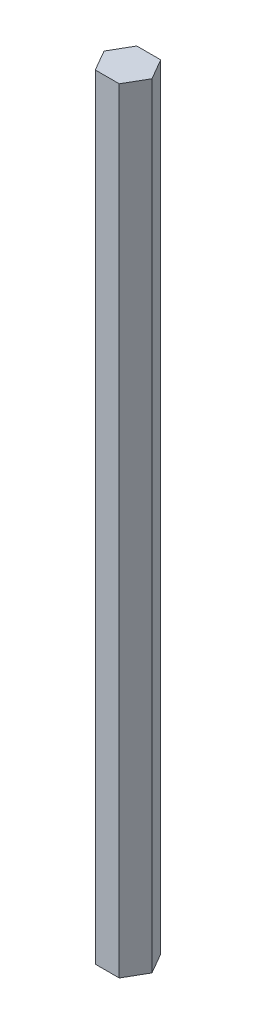
ISO-10303-21;
HEADER;
FILE_DESCRIPTION(('STEP AP214'),'2;1');
FILE_NAME('part.step','',(''),(''),'','','');
FILE_SCHEMA(('AUTOMOTIVE_DESIGN { 1 0 10303 214 1 1 1 1 }'));
ENDSEC;
DATA;
#1=APPLICATION_CONTEXT('core data for automotive mechanical design processes');
#2=APPLICATION_PROTOCOL_DEFINITION('international standard','automotive_design',2000,#1);
#3=PRODUCT_CONTEXT('',#1,'mechanical');
#4=PRODUCT('Part','Part','',(#3));
#5=PRODUCT_RELATED_PRODUCT_CATEGORY('part','',(#4));
#6=PRODUCT_DEFINITION_FORMATION('','',#4);
#7=PRODUCT_DEFINITION_CONTEXT('part definition',#1,'design');
#8=PRODUCT_DEFINITION('design','',#6,#7);
#9=PRODUCT_DEFINITION_SHAPE('','',#8);
#10=(LENGTH_UNIT() NAMED_UNIT(*) SI_UNIT(.MILLI.,.METRE.));
#11=(NAMED_UNIT(*) PLANE_ANGLE_UNIT() SI_UNIT($,.RADIAN.));
#12=(NAMED_UNIT(*) SI_UNIT($,.STERADIAN.) SOLID_ANGLE_UNIT());
#13=UNCERTAINTY_MEASURE_WITH_UNIT(LENGTH_MEASURE(1.E-05),#10,'distance_accuracy_value','');
#14=(GEOMETRIC_REPRESENTATION_CONTEXT(3) GLOBAL_UNCERTAINTY_ASSIGNED_CONTEXT((#13)) GLOBAL_UNIT_ASSIGNED_CONTEXT((#10,
#11,#12)) REPRESENTATION_CONTEXT('',''));
#15=CARTESIAN_POINT('',(0.,0.,0.));
#16=DIRECTION('',(0.,0.,1.));
#17=DIRECTION('',(1.,0.,0.));
#18=AXIS2_PLACEMENT_3D('',#15,#16,#17);
#19=CARTESIAN_POINT('',(1.5,97.,2.59807621135332));
#20=DIRECTION('',(-0.866025403784439,0.,-0.5));
#21=DIRECTION('',(-0.5,0.,0.866025403784439));
#22=AXIS2_PLACEMENT_3D('',#19,#20,#21);
#23=PLANE('',#22);
#24=DIRECTION('',(0.5,0.,-0.866025403784439));
#25=VECTOR('',#24,1.);
#26=CARTESIAN_POINT('',(1.5,0.,2.59807621135332));
#27=LINE('',#26,#25);
#28=CARTESIAN_POINT('',(1.5,0.,2.59807621135332));
#29=VERTEX_POINT('',#28);
#30=CARTESIAN_POINT('',(3.,0.,0.));
#31=VERTEX_POINT('',#30);
#32=EDGE_CURVE('E116',#29,#31,#27,.T.);
#33=ORIENTED_EDGE('',*,*,#32,.T.);
#34=DIRECTION('',(0.,-1.,0.));
#35=VECTOR('',#34,1.);
#36=CARTESIAN_POINT('',(3.,97.,0.));
#37=LINE('',#36,#35);
#38=CARTESIAN_POINT('',(3.,97.,0.));
#39=VERTEX_POINT('',#38);
#40=EDGE_CURVE('E11',#39,#31,#37,.T.);
#41=ORIENTED_EDGE('',*,*,#40,.F.);
#42=DIRECTION('',(0.5,0.,-0.866025403784439));
#43=VECTOR('',#42,1.);
#44=CARTESIAN_POINT('',(1.5,97.,2.59807621135332));
#45=LINE('',#44,#43);
#46=CARTESIAN_POINT('',(1.5,97.,2.59807621135332));
#47=VERTEX_POINT('',#46);
#48=EDGE_CURVE('E127',#47,#39,#45,.T.);
#49=ORIENTED_EDGE('',*,*,#48,.F.);
#50=DIRECTION('',(0.,-1.,0.));
#51=VECTOR('',#50,1.);
#52=CARTESIAN_POINT('',(1.5,97.,2.59807621135332));
#53=LINE('',#52,#51);
#54=EDGE_CURVE('E112',#47,#29,#53,.T.);
#55=ORIENTED_EDGE('',*,*,#54,.T.);
#56=EDGE_LOOP('',(#33,#41,#49,#55));
#57=FACE_BOUND('',#56,.T.);
#58=ADVANCED_FACE('F32',(#57),#23,.F.);
#59=CARTESIAN_POINT('',(3.,97.,0.));
#60=DIRECTION('',(-0.866025403784439,0.,0.5));
#61=DIRECTION('',(0.5,0.,0.866025403784439));
#62=AXIS2_PLACEMENT_3D('',#59,#60,#61);
#63=PLANE('',#62);
#64=DIRECTION('',(-0.5,0.,-0.866025403784439));
#65=VECTOR('',#64,1.);
#66=CARTESIAN_POINT('',(3.,0.,0.));
#67=LINE('',#66,#65);
#68=CARTESIAN_POINT('',(1.5,0.,-2.59807621135332));
#69=VERTEX_POINT('',#68);
#70=EDGE_CURVE('E119',#31,#69,#67,.T.);
#71=ORIENTED_EDGE('',*,*,#70,.T.);
#72=DIRECTION('',(0.,-1.,0.));
#73=VECTOR('',#72,1.);
#74=CARTESIAN_POINT('',(1.5,97.,-2.59807621135332));
#75=LINE('',#74,#73);
#76=CARTESIAN_POINT('',(1.5,97.,-2.59807621135332));
#77=VERTEX_POINT('',#76);
#78=EDGE_CURVE('E40',#77,#69,#75,.T.);
#79=ORIENTED_EDGE('',*,*,#78,.F.);
#80=DIRECTION('',(-0.5,0.,-0.866025403784439));
#81=VECTOR('',#80,1.);
#82=CARTESIAN_POINT('',(3.,97.,0.));
#83=LINE('',#82,#81);
#84=EDGE_CURVE('E85',#39,#77,#83,.T.);
#85=ORIENTED_EDGE('',*,*,#84,.F.);
#86=ORIENTED_EDGE('',*,*,#40,.T.);
#87=EDGE_LOOP('',(#71,#79,#85,#86));
#88=FACE_BOUND('',#87,.T.);
#89=ADVANCED_FACE('F151',(#88),#63,.F.);
#90=CARTESIAN_POINT('',(1.5,97.,-2.59807621135332));
#91=DIRECTION('',(0.,0.,1.));
#92=DIRECTION('',(1.,0.,0.));
#93=AXIS2_PLACEMENT_3D('',#90,#91,#92);
#94=PLANE('',#93);
#95=DIRECTION('',(-1.,0.,0.));
#96=VECTOR('',#95,1.);
#97=CARTESIAN_POINT('',(1.5,0.,-2.59807621135332));
#98=LINE('',#97,#96);
#99=CARTESIAN_POINT('',(-1.5,0.,-2.59807621135332));
#100=VERTEX_POINT('',#99);
#101=EDGE_CURVE('E122',#69,#100,#98,.T.);
#102=ORIENTED_EDGE('',*,*,#101,.T.);
#103=DIRECTION('',(0.,-1.,0.));
#104=VECTOR('',#103,1.);
#105=CARTESIAN_POINT('',(-1.5,97.,-2.59807621135332));
#106=LINE('',#105,#104);
#107=CARTESIAN_POINT('',(-1.5,97.,-2.59807621135332));
#108=VERTEX_POINT('',#107);
#109=EDGE_CURVE('E107',#108,#100,#106,.T.);
#110=ORIENTED_EDGE('',*,*,#109,.F.);
#111=DIRECTION('',(-1.,0.,0.));
#112=VECTOR('',#111,1.);
#113=CARTESIAN_POINT('',(1.5,97.,-2.59807621135332));
#114=LINE('',#113,#112);
#115=EDGE_CURVE('E98',#77,#108,#114,.T.);
#116=ORIENTED_EDGE('',*,*,#115,.F.);
#117=ORIENTED_EDGE('',*,*,#78,.T.);
#118=EDGE_LOOP('',(#102,#110,#116,#117));
#119=FACE_BOUND('',#118,.T.);
#120=ADVANCED_FACE('F133',(#119),#94,.F.);
#121=CARTESIAN_POINT('',(-1.5,97.,-2.59807621135332));
#122=DIRECTION('',(0.866025403784439,0.,0.5));
#123=DIRECTION('',(0.5,0.,-0.866025403784439));
#124=AXIS2_PLACEMENT_3D('',#121,#122,#123);
#125=PLANE('',#124);
#126=DIRECTION('',(-0.5,0.,0.866025403784439));
#127=VECTOR('',#126,1.);
#128=CARTESIAN_POINT('',(-1.5,0.,-2.59807621135332));
#129=LINE('',#128,#127);
#130=CARTESIAN_POINT('',(-3.,0.,0.));
#131=VERTEX_POINT('',#130);
#132=EDGE_CURVE('E106',#100,#131,#129,.T.);
#133=ORIENTED_EDGE('',*,*,#132,.T.);
#134=DIRECTION('',(0.,-1.,0.));
#135=VECTOR('',#134,1.);
#136=CARTESIAN_POINT('',(-3.,97.,0.));
#137=LINE('',#136,#135);
#138=CARTESIAN_POINT('',(-3.,97.,0.));
#139=VERTEX_POINT('',#138);
#140=EDGE_CURVE('E103',#139,#131,#137,.T.);
#141=ORIENTED_EDGE('',*,*,#140,.F.);
#142=DIRECTION('',(-0.5,0.,0.866025403784439));
#143=VECTOR('',#142,1.);
#144=CARTESIAN_POINT('',(-1.5,97.,-2.59807621135332));
#145=LINE('',#144,#143);
#146=EDGE_CURVE('E92',#108,#139,#145,.T.);
#147=ORIENTED_EDGE('',*,*,#146,.F.);
#148=ORIENTED_EDGE('',*,*,#109,.T.);
#149=EDGE_LOOP('',(#133,#141,#147,#148));
#150=FACE_BOUND('',#149,.T.);
#151=ADVANCED_FACE('F104',(#150),#125,.F.);
#152=CARTESIAN_POINT('',(-3.,97.,0.));
#153=DIRECTION('',(0.866025403784439,0.,-0.5));
#154=DIRECTION('',(-0.5,0.,-0.866025403784439));
#155=AXIS2_PLACEMENT_3D('',#152,#153,#154);
#156=PLANE('',#155);
#157=DIRECTION('',(0.5,0.,0.866025403784439));
#158=VECTOR('',#157,1.);
#159=CARTESIAN_POINT('',(-3.,0.,0.));
#160=LINE('',#159,#158);
#161=CARTESIAN_POINT('',(-1.5,0.,2.59807621135332));
#162=VERTEX_POINT('',#161);
#163=EDGE_CURVE('E71',#131,#162,#160,.T.);
#164=ORIENTED_EDGE('',*,*,#163,.T.);
#165=DIRECTION('',(0.,-1.,0.));
#166=VECTOR('',#165,1.);
#167=CARTESIAN_POINT('',(-1.5,97.,2.59807621135332));
#168=LINE('',#167,#166);
#169=CARTESIAN_POINT('',(-1.5,97.,2.59807621135332));
#170=VERTEX_POINT('',#169);
#171=EDGE_CURVE('E108',#170,#162,#168,.T.);
#172=ORIENTED_EDGE('',*,*,#171,.F.);
#173=DIRECTION('',(0.5,0.,0.866025403784439));
#174=VECTOR('',#173,1.);
#175=CARTESIAN_POINT('',(-3.,97.,0.));
#176=LINE('',#175,#174);
#177=EDGE_CURVE('E96',#139,#170,#176,.T.);
#178=ORIENTED_EDGE('',*,*,#177,.F.);
#179=ORIENTED_EDGE('',*,*,#140,.T.);
#180=EDGE_LOOP('',(#164,#172,#178,#179));
#181=FACE_BOUND('',#180,.T.);
#182=ADVANCED_FACE('F110',(#181),#156,.F.);
#183=CARTESIAN_POINT('',(-1.5,97.,2.59807621135332));
#184=DIRECTION('',(0.,0.,-1.));
#185=DIRECTION('',(-1.,0.,0.));
#186=AXIS2_PLACEMENT_3D('',#183,#184,#185);
#187=PLANE('',#186);
#188=DIRECTION('',(1.,0.,0.));
#189=VECTOR('',#188,1.);
#190=CARTESIAN_POINT('',(-1.5,0.,2.59807621135332));
#191=LINE('',#190,#189);
#192=EDGE_CURVE('E77',#162,#29,#191,.T.);
#193=ORIENTED_EDGE('',*,*,#192,.T.);
#194=ORIENTED_EDGE('',*,*,#54,.F.);
#195=DIRECTION('',(1.,0.,0.));
#196=VECTOR('',#195,1.);
#197=CARTESIAN_POINT('',(-1.5,97.,2.59807621135332));
#198=LINE('',#197,#196);
#199=EDGE_CURVE('E48',#170,#47,#198,.T.);
#200=ORIENTED_EDGE('',*,*,#199,.F.);
#201=ORIENTED_EDGE('',*,*,#171,.T.);
#202=EDGE_LOOP('',(#193,#194,#200,#201));
#203=FACE_BOUND('',#202,.T.);
#204=ADVANCED_FACE('F140',(#203),#187,.F.);
#205=CARTESIAN_POINT('',(0.,97.,0.));
#206=DIRECTION('',(0.,1.,0.));
#207=DIRECTION('',(0.,0.,1.));
#208=AXIS2_PLACEMENT_3D('',#205,#206,#207);
#209=PLANE('',#208);
#210=ORIENTED_EDGE('',*,*,#48,.T.);
#211=ORIENTED_EDGE('',*,*,#84,.T.);
#212=ORIENTED_EDGE('',*,*,#115,.T.);
#213=ORIENTED_EDGE('',*,*,#146,.T.);
#214=ORIENTED_EDGE('',*,*,#177,.T.);
#215=ORIENTED_EDGE('',*,*,#199,.T.);
#216=EDGE_LOOP('',(#210,#211,#212,#213,#214,#215));
#217=FACE_BOUND('',#216,.T.);
#218=ADVANCED_FACE('F94',(#217),#209,.T.);
#219=CARTESIAN_POINT('',(0.,0.,0.));
#220=DIRECTION('',(0.,1.,0.));
#221=DIRECTION('',(0.,0.,1.));
#222=AXIS2_PLACEMENT_3D('',#219,#220,#221);
#223=PLANE('',#222);
#224=CARTESIAN_POINT('',(0.,0.,0.));
#225=DIRECTION('',(0.,-1.,0.));
#226=DIRECTION('',(0.,0.,-1.));
#227=AXIS2_PLACEMENT_3D('',#224,#225,#226);
#228=CIRCLE('',#227,1.6);
#229=CARTESIAN_POINT('',(0.,0.,-1.6));
#230=VERTEX_POINT('',#229);
#231=EDGE_CURVE('E213',#230,#230,#228,.T.);
#232=ORIENTED_EDGE('',*,*,#231,.F.);
#233=EDGE_LOOP('',(#232));
#234=FACE_BOUND('',#233,.T.);
#235=ORIENTED_EDGE('',*,*,#32,.F.);
#236=ORIENTED_EDGE('',*,*,#192,.F.);
#237=ORIENTED_EDGE('',*,*,#163,.F.);
#238=ORIENTED_EDGE('',*,*,#132,.F.);
#239=ORIENTED_EDGE('',*,*,#101,.F.);
#240=ORIENTED_EDGE('',*,*,#70,.F.);
#241=EDGE_LOOP('',(#235,#236,#237,#238,#239,#240));
#242=FACE_BOUND('',#241,.T.);
#243=ADVANCED_FACE('F136',(#234,#242),#223,.F.);
#244=CARTESIAN_POINT('',(0.,5.,0.));
#245=DIRECTION('',(0.,-1.,0.));
#246=DIRECTION('',(0.,0.,-1.));
#247=AXIS2_PLACEMENT_3D('',#244,#245,#246);
#248=CYLINDRICAL_SURFACE('',#247,1.6);
#249=CARTESIAN_POINT('',(0.,5.,0.));
#250=DIRECTION('',(0.,-1.,0.));
#251=DIRECTION('',(0.,0.,-1.));
#252=AXIS2_PLACEMENT_3D('',#249,#250,#251);
#253=CIRCLE('',#252,1.6);
#254=CARTESIAN_POINT('',(0.,5.,-1.6));
#255=VERTEX_POINT('',#254);
#256=EDGE_CURVE('E120',#255,#255,#253,.T.);
#257=ORIENTED_EDGE('',*,*,#256,.F.);
#258=EDGE_LOOP('',(#257));
#259=FACE_BOUND('',#258,.T.);
#260=ORIENTED_EDGE('',*,*,#231,.T.);
#261=EDGE_LOOP('',(#260));
#262=FACE_BOUND('',#261,.T.);
#263=ADVANCED_FACE('F188',(#259,#262),#248,.F.);
#264=CARTESIAN_POINT('',(0.,5.,0.));
#265=DIRECTION('',(0.,-1.,0.));
#266=DIRECTION('',(0.,0.,-1.));
#267=AXIS2_PLACEMENT_3D('',#264,#265,#266);
#268=PLANE('',#267);
#269=ORIENTED_EDGE('',*,*,#256,.T.);
#270=EDGE_LOOP('',(#269));
#271=FACE_BOUND('',#270,.T.);
#272=ADVANCED_FACE('F197',(#271),#268,.T.);
#273=CLOSED_SHELL('',(#58,#89,#120,#151,#182,#204,#218,#243,#263,#272));
#274=MANIFOLD_SOLID_BREP('B2',#273);
#275=ADVANCED_BREP_SHAPE_REPRESENTATION('',(#18,#274),#14);
#276=SHAPE_DEFINITION_REPRESENTATION(#9,#275);
ENDSEC;
END-ISO-10303-21;
